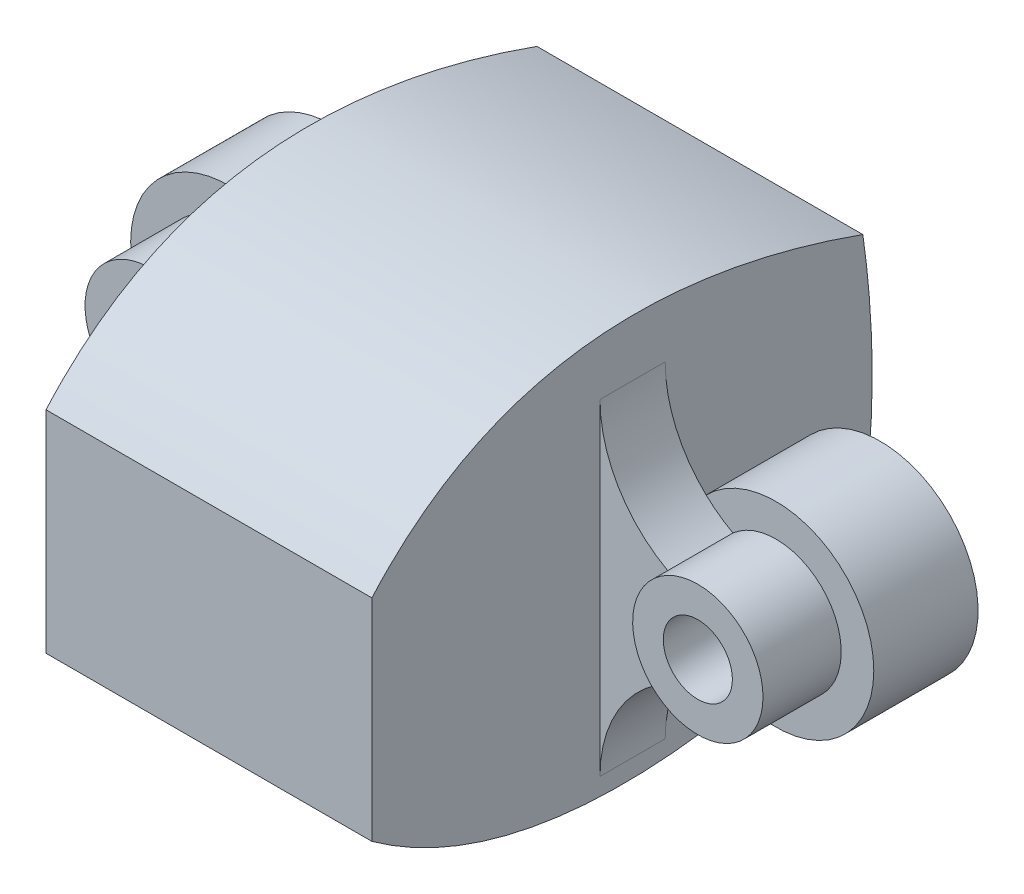
ISO-10303-21;
HEADER;
FILE_DESCRIPTION(('STEP AP214'),'2;1');
FILE_NAME('part.step','',(''),(''),'','','');
FILE_SCHEMA(('AUTOMOTIVE_DESIGN { 1 0 10303 214 1 1 1 1 }'));
ENDSEC;
DATA;
#1=APPLICATION_CONTEXT('core data for automotive mechanical design processes');
#2=APPLICATION_PROTOCOL_DEFINITION('international standard','automotive_design',2000,#1);
#3=PRODUCT_CONTEXT('',#1,'mechanical');
#4=PRODUCT('Part','Part','',(#3));
#5=PRODUCT_RELATED_PRODUCT_CATEGORY('part','',(#4));
#6=PRODUCT_DEFINITION_FORMATION('','',#4);
#7=PRODUCT_DEFINITION_CONTEXT('part definition',#1,'design');
#8=PRODUCT_DEFINITION('design','',#6,#7);
#9=PRODUCT_DEFINITION_SHAPE('','',#8);
#10=(LENGTH_UNIT() NAMED_UNIT(*) SI_UNIT(.MILLI.,.METRE.));
#11=(NAMED_UNIT(*) PLANE_ANGLE_UNIT() SI_UNIT($,.RADIAN.));
#12=(NAMED_UNIT(*) SI_UNIT($,.STERADIAN.) SOLID_ANGLE_UNIT());
#13=UNCERTAINTY_MEASURE_WITH_UNIT(LENGTH_MEASURE(1.E-05),#10,'distance_accuracy_value','');
#14=(GEOMETRIC_REPRESENTATION_CONTEXT(3) GLOBAL_UNCERTAINTY_ASSIGNED_CONTEXT((#13)) GLOBAL_UNIT_ASSIGNED_CONTEXT((#10,
#11,#12)) REPRESENTATION_CONTEXT('',''));
#15=CARTESIAN_POINT('',(0.,0.,0.));
#16=DIRECTION('',(0.,0.,1.));
#17=DIRECTION('',(1.,0.,0.));
#18=AXIS2_PLACEMENT_3D('',#15,#16,#17);
#19=CARTESIAN_POINT('',(27.5,-3.75484590396802,0.696184676668378));
#20=DIRECTION('',(0.,0.,-1.));
#21=DIRECTION('',(-1.,0.,0.));
#22=AXIS2_PLACEMENT_3D('',#19,#20,#21);
#23=PLANE('',#22);
#24=CARTESIAN_POINT('',(-21.0048094716167,-0.00484590396801488,0.696184676668378));
#25=DIRECTION('',(0.,0.,-1.));
#26=DIRECTION('',(-1.,0.,0.));
#27=AXIS2_PLACEMENT_3D('',#24,#25,#26);
#28=CIRCLE('',#27,5.);
#29=CARTESIAN_POINT('',(-17.697620332786,-3.75484590396802,0.696184676668378));
#30=VERTEX_POINT('',#29);
#31=CARTESIAN_POINT('',(-17.697620332786,3.74515409603199,0.696184676668378));
#32=VERTEX_POINT('',#31);
#33=EDGE_CURVE('E164',#30,#32,#28,.F.);
#34=ORIENTED_EDGE('',*,*,#33,.F.);
#35=CARTESIAN_POINT('',(-22.5,-12.5262283224885,0.696184676668378));
#36=DIRECTION('',(0.,0.,-1.));
#37=DIRECTION('',(-1.,0.,0.));
#38=AXIS2_PLACEMENT_3D('',#35,#36,#37);
#39=CIRCLE('',#38,10.);
#40=CARTESIAN_POINT('',(-12.5,-12.5262283224885,0.696184676668378));
#41=VERTEX_POINT('',#40);
#42=EDGE_CURVE('E44',#30,#41,#39,.T.);
#43=ORIENTED_EDGE('',*,*,#42,.T.);
#44=DIRECTION('',(0.,1.,0.));
#45=VECTOR('',#44,1.);
#46=CARTESIAN_POINT('',(-12.5,-13.9143828199088,0.696184676668378));
#47=LINE('',#46,#45);
#48=CARTESIAN_POINT('',(-12.5,12.5165365145524,0.696184676668378));
#49=VERTEX_POINT('',#48);
#50=EDGE_CURVE('E312',#41,#49,#47,.T.);
#51=ORIENTED_EDGE('',*,*,#50,.T.);
#52=CARTESIAN_POINT('',(-22.5,12.5165365145524,0.696184676668378));
#53=DIRECTION('',(0.,0.,-1.));
#54=DIRECTION('',(-1.,0.,0.));
#55=AXIS2_PLACEMENT_3D('',#52,#53,#54);
#56=CIRCLE('',#55,10.);
#57=EDGE_CURVE('E348',#49,#32,#56,.T.);
#58=ORIENTED_EDGE('',*,*,#57,.T.);
#59=EDGE_LOOP('',(#34,#43,#51,#58));
#60=FACE_BOUND('',#59,.T.);
#61=ADVANCED_FACE('F36',(#60),#23,.F.);
#62=CARTESIAN_POINT('',(21.0048094716167,-0.00484590396801488,0.696184676668378));
#63=DIRECTION('',(0.,0.,-1.));
#64=DIRECTION('',(-1.,0.,0.));
#65=AXIS2_PLACEMENT_3D('',#62,#63,#64);
#66=CIRCLE('',#65,5.);
#67=CARTESIAN_POINT('',(17.697620332786,3.74515409603199,0.696184676668378));
#68=VERTEX_POINT('',#67);
#69=CARTESIAN_POINT('',(17.697620332786,-3.75484590396802,0.696184676668378));
#70=VERTEX_POINT('',#69);
#71=EDGE_CURVE('E177',#68,#70,#66,.F.);
#72=ORIENTED_EDGE('',*,*,#71,.F.);
#73=CARTESIAN_POINT('',(22.5,12.5165365145524,0.696184676668378));
#74=DIRECTION('',(0.,0.,-1.));
#75=DIRECTION('',(-1.,0.,0.));
#76=AXIS2_PLACEMENT_3D('',#73,#74,#75);
#77=CIRCLE('',#76,10.);
#78=CARTESIAN_POINT('',(12.5,12.5165365145524,0.696184676668378));
#79=VERTEX_POINT('',#78);
#80=EDGE_CURVE('E342',#68,#79,#77,.T.);
#81=ORIENTED_EDGE('',*,*,#80,.T.);
#82=DIRECTION('',(0.,1.,0.));
#83=VECTOR('',#82,1.);
#84=CARTESIAN_POINT('',(12.5,-13.9143828199088,0.696184676668378));
#85=LINE('',#84,#83);
#86=CARTESIAN_POINT('',(12.5,-12.5262283224885,0.696184676668378));
#87=VERTEX_POINT('',#86);
#88=EDGE_CURVE('E190',#87,#79,#85,.T.);
#89=ORIENTED_EDGE('',*,*,#88,.F.);
#90=CARTESIAN_POINT('',(22.5,-12.5262283224885,0.696184676668378));
#91=DIRECTION('',(0.,0.,-1.));
#92=DIRECTION('',(-1.,0.,0.));
#93=AXIS2_PLACEMENT_3D('',#90,#91,#92);
#94=CIRCLE('',#93,10.);
#95=EDGE_CURVE('E334',#87,#70,#94,.T.);
#96=ORIENTED_EDGE('',*,*,#95,.T.);
#97=EDGE_LOOP('',(#72,#81,#89,#96));
#98=FACE_BOUND('',#97,.T.);
#99=ADVANCED_FACE('F238',(#98),#23,.F.);
#100=CARTESIAN_POINT('',(12.5,-13.9143828199088,-0.592625515878692));
#101=DIRECTION('',(1.,0.,0.));
#102=DIRECTION('',(0.,0.,-1.));
#103=AXIS2_PLACEMENT_3D('',#100,#101,#102);
#104=PLANE('',#103);
#105=CARTESIAN_POINT('',(12.5,-8.09421069616466,18.1961846766684));
#106=CARTESIAN_POINT('',(12.5,-16.4385603035779,6.64246983563475));
#107=CARTESIAN_POINT('',(12.5,-14.3857687324639,-8.25521453405886));
#108=CARTESIAN_POINT('',(12.5,-10.7478647549805,-18.0989547084256));
#109=B_SPLINE_CURVE_WITH_KNOTS('',3,(#105,#106,#107,#108),.UNSPECIFIED.,.F.,.F.,(4,4),(0.,1.),.UNSPECIFIED.);
#110=CARTESIAN_POINT('',(12.5,-8.09421069616467,18.1961846766684));
#111=VERTEX_POINT('',#110);
#112=CARTESIAN_POINT('',(12.5,-10.7478647549805,-18.0989547084256));
#113=VERTEX_POINT('',#112);
#114=EDGE_CURVE('E197',#111,#113,#109,.T.);
#115=ORIENTED_EDGE('',*,*,#114,.T.);
#116=CARTESIAN_POINT('',(12.5,-10.7478647549805,-18.0989547084256));
#117=CARTESIAN_POINT('',(12.5,-0.263434206745711,-21.4154582491938));
#118=CARTESIAN_POINT('',(12.5,13.3918270058603,-19.4685826097499));
#119=B_SPLINE_CURVE_WITH_KNOTS('',2,(#116,#117,#118),.UNSPECIFIED.,.F.,.F.,(3,3),(0.,1.),.UNSPECIFIED.);
#120=CARTESIAN_POINT('',(12.5,13.3918270058603,-19.4685826097499));
#121=VERTEX_POINT('',#120);
#122=EDGE_CURVE('E203',#113,#121,#119,.T.);
#123=ORIENTED_EDGE('',*,*,#122,.T.);
#124=CARTESIAN_POINT('',(12.5,13.3918270058603,-19.4685826097499));
#125=CARTESIAN_POINT('',(12.5,22.3791261316538,5.56746495496059));
#126=CARTESIAN_POINT('',(12.5,8.08451888822864,18.1961846766684));
#127=B_SPLINE_CURVE_WITH_KNOTS('',2,(#124,#125,#126),.UNSPECIFIED.,.F.,.F.,(3,3),(0.,1.),.UNSPECIFIED.);
#128=CARTESIAN_POINT('',(12.5,8.08451888822864,18.1961846766684));
#129=VERTEX_POINT('',#128);
#130=EDGE_CURVE('E268',#121,#129,#127,.T.);
#131=ORIENTED_EDGE('',*,*,#130,.T.);
#132=DIRECTION('',(0.,-1.,0.));
#133=VECTOR('',#132,1.);
#134=CARTESIAN_POINT('',(12.5,-8.09421069616467,18.1961846766684));
#135=LINE('',#134,#133);
#136=EDGE_CURVE('E273',#129,#111,#135,.T.);
#137=ORIENTED_EDGE('',*,*,#136,.T.);
#138=EDGE_LOOP('',(#115,#123,#131,#137));
#139=FACE_BOUND('',#138,.T.);
#140=DIRECTION('',(0.,0.,1.));
#141=VECTOR('',#140,1.);
#142=CARTESIAN_POINT('',(12.5,-12.5262283224885,0.696184676668378));
#143=LINE('',#142,#141);
#144=CARTESIAN_POINT('',(12.5,-12.5262283224885,-4.30381532333162));
#145=VERTEX_POINT('',#144);
#146=EDGE_CURVE('E320',#145,#87,#143,.T.);
#147=ORIENTED_EDGE('',*,*,#146,.T.);
#148=ORIENTED_EDGE('',*,*,#88,.T.);
#149=DIRECTION('',(0.,0.,1.));
#150=VECTOR('',#149,1.);
#151=CARTESIAN_POINT('',(12.5,12.5165365145524,-4.30381532333162));
#152=LINE('',#151,#150);
#153=CARTESIAN_POINT('',(12.5,12.5165365145524,-4.30381532333162));
#154=VERTEX_POINT('',#153);
#155=EDGE_CURVE('E317',#79,#154,#152,.F.);
#156=ORIENTED_EDGE('',*,*,#155,.T.);
#157=DIRECTION('',(0.,-1.,0.));
#158=VECTOR('',#157,1.);
#159=CARTESIAN_POINT('',(12.5,-13.9143828199088,-4.30381532333162));
#160=LINE('',#159,#158);
#161=EDGE_CURVE('E194',#154,#145,#160,.T.);
#162=ORIENTED_EDGE('',*,*,#161,.T.);
#163=EDGE_LOOP('',(#147,#148,#156,#162));
#164=FACE_BOUND('',#163,.T.);
#165=ADVANCED_FACE('F244',(#139,#164),#104,.T.);
#166=CARTESIAN_POINT('',(-12.5,-13.9143828199088,-0.592625515878692));
#167=DIRECTION('',(1.,0.,0.));
#168=DIRECTION('',(0.,0.,-1.));
#169=AXIS2_PLACEMENT_3D('',#166,#167,#168);
#170=PLANE('',#169);
#171=CARTESIAN_POINT('',(-12.5,-8.09421069616466,18.1961846766684));
#172=CARTESIAN_POINT('',(-12.5,-16.4385603035779,6.64246983563475));
#173=CARTESIAN_POINT('',(-12.5,-14.3857687324639,-8.25521453405886));
#174=CARTESIAN_POINT('',(-12.5,-10.7478647549805,-18.0989547084256));
#175=B_SPLINE_CURVE_WITH_KNOTS('',3,(#171,#172,#173,#174),.UNSPECIFIED.,.F.,.F.,(4,4),(0.,1.),.UNSPECIFIED.);
#176=CARTESIAN_POINT('',(-12.5,-8.09421069616467,18.1961846766684));
#177=VERTEX_POINT('',#176);
#178=CARTESIAN_POINT('',(-12.5,-10.7478647549805,-18.0989547084256));
#179=VERTEX_POINT('',#178);
#180=EDGE_CURVE('E196',#177,#179,#175,.T.);
#181=ORIENTED_EDGE('',*,*,#180,.F.);
#182=DIRECTION('',(0.,-1.,0.));
#183=VECTOR('',#182,1.);
#184=CARTESIAN_POINT('',(-12.5,-8.09421069616467,18.1961846766684));
#185=LINE('',#184,#183);
#186=CARTESIAN_POINT('',(-12.5,8.08451888822864,18.1961846766684));
#187=VERTEX_POINT('',#186);
#188=EDGE_CURVE('E204',#187,#177,#185,.T.);
#189=ORIENTED_EDGE('',*,*,#188,.F.);
#190=CARTESIAN_POINT('',(-12.5,13.3918270058603,-19.4685826097499));
#191=CARTESIAN_POINT('',(-12.5,22.3791261316538,5.56746495496059));
#192=CARTESIAN_POINT('',(-12.5,8.08451888822864,18.1961846766684));
#193=B_SPLINE_CURVE_WITH_KNOTS('',2,(#190,#191,#192),.UNSPECIFIED.,.F.,.F.,(3,3),(0.,1.),.UNSPECIFIED.);
#194=CARTESIAN_POINT('',(-12.5,13.3918270058603,-19.4685826097499));
#195=VERTEX_POINT('',#194);
#196=EDGE_CURVE('E290',#195,#187,#193,.T.);
#197=ORIENTED_EDGE('',*,*,#196,.F.);
#198=CARTESIAN_POINT('',(-12.5,-10.7478647549805,-18.0989547084256));
#199=CARTESIAN_POINT('',(-12.5,-0.263434206745711,-21.4154582491938));
#200=CARTESIAN_POINT('',(-12.5,13.3918270058603,-19.4685826097499));
#201=B_SPLINE_CURVE_WITH_KNOTS('',2,(#198,#199,#200),.UNSPECIFIED.,.F.,.F.,(3,3),(0.,1.),.UNSPECIFIED.);
#202=EDGE_CURVE('E283',#179,#195,#201,.T.);
#203=ORIENTED_EDGE('',*,*,#202,.F.);
#204=EDGE_LOOP('',(#181,#189,#197,#203));
#205=FACE_BOUND('',#204,.T.);
#206=DIRECTION('',(0.,-1.,0.));
#207=VECTOR('',#206,1.);
#208=CARTESIAN_POINT('',(-12.5,-13.9143828199088,-4.30381532333162));
#209=LINE('',#208,#207);
#210=CARTESIAN_POINT('',(-12.5,12.5165365145524,-4.30381532333162));
#211=VERTEX_POINT('',#210);
#212=CARTESIAN_POINT('',(-12.5,-12.5262283224885,-4.30381532333162));
#213=VERTEX_POINT('',#212);
#214=EDGE_CURVE('E314',#211,#213,#209,.T.);
#215=ORIENTED_EDGE('',*,*,#214,.F.);
#216=DIRECTION('',(0.,0.,-1.));
#217=VECTOR('',#216,1.);
#218=CARTESIAN_POINT('',(-12.5,12.5165365145524,-0.592625515878692));
#219=LINE('',#218,#217);
#220=EDGE_CURVE('E148',#211,#49,#219,.F.);
#221=ORIENTED_EDGE('',*,*,#220,.T.);
#222=ORIENTED_EDGE('',*,*,#50,.F.);
#223=DIRECTION('',(0.,0.,-1.));
#224=VECTOR('',#223,1.);
#225=CARTESIAN_POINT('',(-12.5,-12.5262283224885,-0.592625515878692));
#226=LINE('',#225,#224);
#227=EDGE_CURVE('E328',#41,#213,#226,.T.);
#228=ORIENTED_EDGE('',*,*,#227,.T.);
#229=EDGE_LOOP('',(#215,#221,#222,#228));
#230=FACE_BOUND('',#229,.T.);
#231=ADVANCED_FACE('F218',(#205,#230),#170,.F.);
#232=DIRECTION('',(-1.,0.,0.));
#233=VECTOR('',#232,1.);
#234=SURFACE_OF_LINEAR_EXTRUSION('',#109,#233);
#235=ORIENTED_EDGE('',*,*,#180,.T.);
#236=DIRECTION('',(-1.,0.,0.));
#237=VECTOR('',#236,1.);
#238=CARTESIAN_POINT('',(12.5,-10.7478647549805,-18.0989547084256));
#239=LINE('',#238,#237);
#240=EDGE_CURVE('E309',#113,#179,#239,.T.);
#241=ORIENTED_EDGE('',*,*,#240,.F.);
#242=ORIENTED_EDGE('',*,*,#114,.F.);
#243=DIRECTION('',(-1.,0.,0.));
#244=VECTOR('',#243,1.);
#245=CARTESIAN_POINT('',(12.5,-8.09421069616467,18.1961846766684));
#246=LINE('',#245,#244);
#247=EDGE_CURVE('E278',#111,#177,#246,.T.);
#248=ORIENTED_EDGE('',*,*,#247,.T.);
#249=EDGE_LOOP('',(#235,#241,#242,#248));
#250=FACE_BOUND('',#249,.T.);
#251=ADVANCED_FACE('F213',(#250),#234,.F.);
#252=DIRECTION('',(-1.,0.,0.));
#253=VECTOR('',#252,1.);
#254=SURFACE_OF_LINEAR_EXTRUSION('',#119,#253);
#255=ORIENTED_EDGE('',*,*,#202,.T.);
#256=DIRECTION('',(-1.,0.,0.));
#257=VECTOR('',#256,1.);
#258=CARTESIAN_POINT('',(12.5,13.3918270058603,-19.4685826097499));
#259=LINE('',#258,#257);
#260=EDGE_CURVE('E306',#121,#195,#259,.T.);
#261=ORIENTED_EDGE('',*,*,#260,.F.);
#262=ORIENTED_EDGE('',*,*,#122,.F.);
#263=ORIENTED_EDGE('',*,*,#240,.T.);
#264=EDGE_LOOP('',(#255,#261,#262,#263));
#265=FACE_BOUND('',#264,.T.);
#266=ADVANCED_FACE('F217',(#265),#254,.F.);
#267=DIRECTION('',(-1.,0.,0.));
#268=VECTOR('',#267,1.);
#269=SURFACE_OF_LINEAR_EXTRUSION('',#127,#268);
#270=ORIENTED_EDGE('',*,*,#196,.T.);
#271=DIRECTION('',(-1.,0.,0.));
#272=VECTOR('',#271,1.);
#273=CARTESIAN_POINT('',(12.5,8.08451888822864,18.1961846766684));
#274=LINE('',#273,#272);
#275=EDGE_CURVE('E303',#129,#187,#274,.T.);
#276=ORIENTED_EDGE('',*,*,#275,.F.);
#277=ORIENTED_EDGE('',*,*,#130,.F.);
#278=ORIENTED_EDGE('',*,*,#260,.T.);
#279=EDGE_LOOP('',(#270,#276,#277,#278));
#280=FACE_BOUND('',#279,.T.);
#281=ADVANCED_FACE('F264',(#280),#269,.F.);
#282=CARTESIAN_POINT('',(12.5,-8.09421069616467,18.1961846766684));
#283=DIRECTION('',(0.,0.,-1.));
#284=DIRECTION('',(-1.,0.,0.));
#285=AXIS2_PLACEMENT_3D('',#282,#283,#284);
#286=PLANE('',#285);
#287=ORIENTED_EDGE('',*,*,#188,.T.);
#288=ORIENTED_EDGE('',*,*,#247,.F.);
#289=ORIENTED_EDGE('',*,*,#136,.F.);
#290=ORIENTED_EDGE('',*,*,#275,.T.);
#291=EDGE_LOOP('',(#287,#288,#289,#290));
#292=FACE_BOUND('',#291,.T.);
#293=ADVANCED_FACE('F262',(#292),#286,.F.);
#294=CARTESIAN_POINT('',(27.5,-3.75484590396802,-4.30381532333162));
#295=DIRECTION('',(0.,0.,1.));
#296=DIRECTION('',(1.,0.,0.));
#297=AXIS2_PLACEMENT_3D('',#294,#295,#296);
#298=PLANE('',#297);
#299=CARTESIAN_POINT('',(-21.0048094716167,-0.00484590396801488,-4.30381532333162));
#300=DIRECTION('',(0.,0.,1.));
#301=DIRECTION('',(1.,0.,0.));
#302=AXIS2_PLACEMENT_3D('',#299,#300,#301);
#303=CIRCLE('',#302,7.5);
#304=CARTESIAN_POINT('',(-15.6421857546785,5.2384609600761,-4.30381532333162));
#305=VERTEX_POINT('',#304);
#306=CARTESIAN_POINT('',(-15.6421857546785,-5.24815276801212,-4.30381532333162));
#307=VERTEX_POINT('',#306);
#308=EDGE_CURVE('E50',#305,#307,#303,.F.);
#309=ORIENTED_EDGE('',*,*,#308,.F.);
#310=CARTESIAN_POINT('',(-22.5,12.5165365145524,-4.30381532333162));
#311=DIRECTION('',(0.,0.,1.));
#312=DIRECTION('',(1.,0.,0.));
#313=AXIS2_PLACEMENT_3D('',#310,#311,#312);
#314=CIRCLE('',#313,10.);
#315=EDGE_CURVE('E345',#305,#211,#314,.T.);
#316=ORIENTED_EDGE('',*,*,#315,.T.);
#317=ORIENTED_EDGE('',*,*,#214,.T.);
#318=CARTESIAN_POINT('',(-22.5,-12.5262283224885,-4.30381532333162));
#319=DIRECTION('',(0.,0.,1.));
#320=DIRECTION('',(1.,0.,0.));
#321=AXIS2_PLACEMENT_3D('',#318,#319,#320);
#322=CIRCLE('',#321,10.);
#323=EDGE_CURVE('E11',#213,#307,#322,.T.);
#324=ORIENTED_EDGE('',*,*,#323,.T.);
#325=EDGE_LOOP('',(#309,#316,#317,#324));
#326=FACE_BOUND('',#325,.T.);
#327=ADVANCED_FACE('F254',(#326),#298,.F.);
#328=CARTESIAN_POINT('',(21.0048094716167,-0.00484590396801488,-4.30381532333162));
#329=DIRECTION('',(0.,0.,-1.));
#330=DIRECTION('',(-1.,0.,0.));
#331=AXIS2_PLACEMENT_3D('',#328,#329,#330);
#332=CIRCLE('',#331,7.5);
#333=CARTESIAN_POINT('',(15.6421857546785,-5.24815276801213,-4.30381532333162));
#334=VERTEX_POINT('',#333);
#335=CARTESIAN_POINT('',(15.6421857546785,5.2384609600761,-4.30381532333162));
#336=VERTEX_POINT('',#335);
#337=EDGE_CURVE('E58',#334,#336,#332,.T.);
#338=ORIENTED_EDGE('',*,*,#337,.F.);
#339=CARTESIAN_POINT('',(22.5,-12.5262283224885,-4.30381532333162));
#340=DIRECTION('',(0.,0.,1.));
#341=DIRECTION('',(1.,0.,0.));
#342=AXIS2_PLACEMENT_3D('',#339,#340,#341);
#343=CIRCLE('',#342,10.);
#344=EDGE_CURVE('E336',#334,#145,#343,.T.);
#345=ORIENTED_EDGE('',*,*,#344,.T.);
#346=ORIENTED_EDGE('',*,*,#161,.F.);
#347=CARTESIAN_POINT('',(22.5,12.5165365145524,-4.30381532333162));
#348=DIRECTION('',(0.,0.,1.));
#349=DIRECTION('',(1.,0.,0.));
#350=AXIS2_PLACEMENT_3D('',#347,#348,#349);
#351=CIRCLE('',#350,10.);
#352=EDGE_CURVE('E339',#154,#336,#351,.T.);
#353=ORIENTED_EDGE('',*,*,#352,.T.);
#354=EDGE_LOOP('',(#338,#345,#346,#353));
#355=FACE_BOUND('',#354,.T.);
#356=ADVANCED_FACE('F250',(#355),#298,.F.);
#357=CARTESIAN_POINT('',(21.0048094716167,-0.00484590396801488,-4.30381532333162));
#358=DIRECTION('',(0.,0.,-1.));
#359=DIRECTION('',(-1.,0.,0.));
#360=AXIS2_PLACEMENT_3D('',#357,#358,#359);
#361=PLANE('',#360);
#362=CARTESIAN_POINT('',(21.0048094716167,-0.00484590396801488,-4.30381532333162));
#363=DIRECTION('',(0.,0.,1.));
#364=DIRECTION('',(1.,0.,0.));
#365=AXIS2_PLACEMENT_3D('',#362,#363,#364);
#366=CIRCLE('',#365,5.);
#367=CARTESIAN_POINT('',(17.697620332786,-3.75484590396802,-4.30381532333162));
#368=VERTEX_POINT('',#367);
#369=CARTESIAN_POINT('',(17.697620332786,3.74515409603199,-4.30381532333162));
#370=VERTEX_POINT('',#369);
#371=EDGE_CURVE('E163',#368,#370,#366,.T.);
#372=ORIENTED_EDGE('',*,*,#371,.F.);
#373=CARTESIAN_POINT('',(22.5,-12.5262283224885,-4.30381532333162));
#374=DIRECTION('',(0.,0.,-1.));
#375=DIRECTION('',(-1.,0.,0.));
#376=AXIS2_PLACEMENT_3D('',#373,#374,#375);
#377=CIRCLE('',#376,10.);
#378=EDGE_CURVE('E325',#368,#334,#377,.F.);
#379=ORIENTED_EDGE('',*,*,#378,.T.);
#380=EDGE_CURVE('E191',#336,#334,#332,.T.);
#381=ORIENTED_EDGE('',*,*,#380,.F.);
#382=CARTESIAN_POINT('',(22.5,12.5165365145524,-4.30381532333162));
#383=DIRECTION('',(0.,0.,-1.));
#384=DIRECTION('',(-1.,0.,0.));
#385=AXIS2_PLACEMENT_3D('',#382,#383,#384);
#386=CIRCLE('',#385,10.);
#387=EDGE_CURVE('E323',#336,#370,#386,.F.);
#388=ORIENTED_EDGE('',*,*,#387,.T.);
#389=EDGE_LOOP('',(#372,#379,#381,#388));
#390=FACE_BOUND('',#389,.T.);
#391=ADVANCED_FACE('F253',(#390),#361,.F.);
#392=CARTESIAN_POINT('',(21.0048094716167,-0.00484590396801488,-12.3038153233316));
#393=DIRECTION('',(0.,0.,1.));
#394=DIRECTION('',(1.,0.,0.));
#395=AXIS2_PLACEMENT_3D('',#392,#393,#394);
#396=CYLINDRICAL_SURFACE('',#395,7.5);
#397=CARTESIAN_POINT('',(21.0048094716167,-0.00484590396801488,-12.3038153233316));
#398=DIRECTION('',(0.,0.,-1.));
#399=DIRECTION('',(-1.,0.,0.));
#400=AXIS2_PLACEMENT_3D('',#397,#398,#399);
#401=CIRCLE('',#400,7.5);
#402=CARTESIAN_POINT('',(13.5048094716167,-0.00484590396801488,-12.3038153233316));
#403=VERTEX_POINT('',#402);
#404=EDGE_CURVE('E187',#403,#403,#401,.T.);
#405=ORIENTED_EDGE('',*,*,#404,.F.);
#406=EDGE_LOOP('',(#405));
#407=FACE_BOUND('',#406,.T.);
#408=ORIENTED_EDGE('',*,*,#337,.T.);
#409=ORIENTED_EDGE('',*,*,#380,.T.);
#410=EDGE_LOOP('',(#408,#409));
#411=FACE_BOUND('',#410,.T.);
#412=ADVANCED_FACE('F248',(#407,#411),#396,.T.);
#413=CARTESIAN_POINT('',(21.0048094716167,-0.00484590396801488,-12.3038153233316));
#414=DIRECTION('',(0.,0.,-1.));
#415=DIRECTION('',(-1.,0.,0.));
#416=AXIS2_PLACEMENT_3D('',#413,#414,#415);
#417=PLANE('',#416);
#418=ORIENTED_EDGE('',*,*,#404,.T.);
#419=EDGE_LOOP('',(#418));
#420=FACE_BOUND('',#419,.T.);
#421=ADVANCED_FACE('F399',(#420),#417,.T.);
#422=CARTESIAN_POINT('',(-21.0048094716167,-0.00484590396801488,-4.30381532333162));
#423=DIRECTION('',(0.,0.,-1.));
#424=DIRECTION('',(-1.,0.,0.));
#425=AXIS2_PLACEMENT_3D('',#422,#423,#424);
#426=PLANE('',#425);
#427=CARTESIAN_POINT('',(-21.0048094716167,-0.00484590396801488,-4.30381532333162));
#428=DIRECTION('',(0.,0.,1.));
#429=DIRECTION('',(1.,0.,0.));
#430=AXIS2_PLACEMENT_3D('',#427,#428,#429);
#431=CIRCLE('',#430,5.);
#432=CARTESIAN_POINT('',(-17.697620332786,3.74515409603199,-4.30381532333162));
#433=VERTEX_POINT('',#432);
#434=CARTESIAN_POINT('',(-17.697620332786,-3.75484590396802,-4.30381532333162));
#435=VERTEX_POINT('',#434);
#436=EDGE_CURVE('E141',#433,#435,#431,.T.);
#437=ORIENTED_EDGE('',*,*,#436,.F.);
#438=CARTESIAN_POINT('',(-22.5,12.5165365145524,-4.30381532333162));
#439=DIRECTION('',(0.,0.,-1.));
#440=DIRECTION('',(-1.,0.,0.));
#441=AXIS2_PLACEMENT_3D('',#438,#439,#440);
#442=CIRCLE('',#441,10.);
#443=EDGE_CURVE('E147',#433,#305,#442,.F.);
#444=ORIENTED_EDGE('',*,*,#443,.T.);
#445=CARTESIAN_POINT('',(-21.0048094716167,-0.00484590396801488,-4.30381532333162));
#446=DIRECTION('',(0.,0.,-1.));
#447=DIRECTION('',(-1.,0.,0.));
#448=AXIS2_PLACEMENT_3D('',#445,#446,#447);
#449=CIRCLE('',#448,7.5);
#450=EDGE_CURVE('E143',#307,#305,#449,.T.);
#451=ORIENTED_EDGE('',*,*,#450,.F.);
#452=CARTESIAN_POINT('',(-22.5,-12.5262283224885,-4.30381532333162));
#453=DIRECTION('',(0.,0.,-1.));
#454=DIRECTION('',(-1.,0.,0.));
#455=AXIS2_PLACEMENT_3D('',#452,#453,#454);
#456=CIRCLE('',#455,10.);
#457=EDGE_CURVE('E137',#307,#435,#456,.F.);
#458=ORIENTED_EDGE('',*,*,#457,.T.);
#459=EDGE_LOOP('',(#437,#444,#451,#458));
#460=FACE_BOUND('',#459,.T.);
#461=ADVANCED_FACE('F139',(#460),#426,.F.);
#462=CARTESIAN_POINT('',(-21.0048094716167,-0.00484590396801488,-12.3038153233316));
#463=DIRECTION('',(0.,0.,1.));
#464=DIRECTION('',(1.,0.,0.));
#465=AXIS2_PLACEMENT_3D('',#462,#463,#464);
#466=CYLINDRICAL_SURFACE('',#465,7.5);
#467=CARTESIAN_POINT('',(-21.0048094716167,-0.00484590396801488,-12.3038153233316));
#468=DIRECTION('',(0.,0.,-1.));
#469=DIRECTION('',(-1.,0.,0.));
#470=AXIS2_PLACEMENT_3D('',#467,#468,#469);
#471=CIRCLE('',#470,7.5);
#472=CARTESIAN_POINT('',(-28.5048094716167,-0.00484590396801488,-12.3038153233316));
#473=VERTEX_POINT('',#472);
#474=EDGE_CURVE('E183',#473,#473,#471,.T.);
#475=ORIENTED_EDGE('',*,*,#474,.F.);
#476=EDGE_LOOP('',(#475));
#477=FACE_BOUND('',#476,.T.);
#478=ORIENTED_EDGE('',*,*,#308,.T.);
#479=ORIENTED_EDGE('',*,*,#450,.T.);
#480=EDGE_LOOP('',(#478,#479));
#481=FACE_BOUND('',#480,.T.);
#482=ADVANCED_FACE('F411',(#477,#481),#466,.T.);
#483=CARTESIAN_POINT('',(-21.0048094716167,-0.00484590396801488,-12.3038153233316));
#484=DIRECTION('',(0.,0.,-1.));
#485=DIRECTION('',(-1.,0.,0.));
#486=AXIS2_PLACEMENT_3D('',#483,#484,#485);
#487=PLANE('',#486);
#488=ORIENTED_EDGE('',*,*,#474,.T.);
#489=EDGE_LOOP('',(#488));
#490=FACE_BOUND('',#489,.T.);
#491=ADVANCED_FACE('F385',(#490),#487,.T.);
#492=CARTESIAN_POINT('',(21.0048094716167,-0.00484590396801488,1.69618467666838));
#493=DIRECTION('',(0.,0.,-1.));
#494=DIRECTION('',(-1.,0.,0.));
#495=AXIS2_PLACEMENT_3D('',#492,#493,#494);
#496=CYLINDRICAL_SURFACE('',#495,5.);
#497=CARTESIAN_POINT('',(21.0048094716167,-0.00484590396801488,1.69618467666838));
#498=DIRECTION('',(0.,0.,1.));
#499=DIRECTION('',(1.,0.,0.));
#500=AXIS2_PLACEMENT_3D('',#497,#498,#499);
#501=CIRCLE('',#500,5.);
#502=CARTESIAN_POINT('',(26.0048094716167,-0.00484590396801488,1.69618467666838));
#503=VERTEX_POINT('',#502);
#504=EDGE_CURVE('E167',#503,#503,#501,.T.);
#505=ORIENTED_EDGE('',*,*,#504,.F.);
#506=EDGE_LOOP('',(#505));
#507=FACE_BOUND('',#506,.T.);
#508=ORIENTED_EDGE('',*,*,#371,.T.);
#509=DIRECTION('',(0.,0.,-1.));
#510=VECTOR('',#509,1.);
#511=CARTESIAN_POINT('',(17.697620332786,3.74515409603199,1.69618467666838));
#512=LINE('',#511,#510);
#513=EDGE_CURVE('E180',#370,#68,#512,.F.);
#514=ORIENTED_EDGE('',*,*,#513,.T.);
#515=ORIENTED_EDGE('',*,*,#71,.T.);
#516=DIRECTION('',(0.,0.,-1.));
#517=VECTOR('',#516,1.);
#518=CARTESIAN_POINT('',(17.697620332786,-3.75484590396802,1.69618467666838));
#519=LINE('',#518,#517);
#520=EDGE_CURVE('E173',#70,#368,#519,.T.);
#521=ORIENTED_EDGE('',*,*,#520,.T.);
#522=EDGE_LOOP('',(#508,#514,#515,#521));
#523=FACE_BOUND('',#522,.T.);
#524=ADVANCED_FACE('F379',(#507,#523),#496,.T.);
#525=CARTESIAN_POINT('',(21.0048094716167,-0.00484590396801488,1.69618467666838));
#526=DIRECTION('',(0.,0.,1.));
#527=DIRECTION('',(1.,0.,0.));
#528=AXIS2_PLACEMENT_3D('',#525,#526,#527);
#529=PLANE('',#528);
#530=CARTESIAN_POINT('',(21.0048094716167,-0.00484590396801488,1.69618467666838));
#531=DIRECTION('',(0.,0.,1.));
#532=DIRECTION('',(1.,0.,0.));
#533=AXIS2_PLACEMENT_3D('',#530,#531,#532);
#534=CIRCLE('',#533,2.65);
#535=CARTESIAN_POINT('',(23.6548094716167,-0.00484590396801488,1.69618467666838));
#536=VERTEX_POINT('',#535);
#537=EDGE_CURVE('E361',#536,#536,#534,.T.);
#538=ORIENTED_EDGE('',*,*,#537,.F.);
#539=EDGE_LOOP('',(#538));
#540=FACE_BOUND('',#539,.T.);
#541=ORIENTED_EDGE('',*,*,#504,.T.);
#542=EDGE_LOOP('',(#541));
#543=FACE_BOUND('',#542,.T.);
#544=ADVANCED_FACE('F376',(#540,#543),#529,.T.);
#545=CARTESIAN_POINT('',(-21.0048094716167,-0.00484590396801488,1.69618467666838));
#546=DIRECTION('',(0.,0.,-1.));
#547=DIRECTION('',(-1.,0.,0.));
#548=AXIS2_PLACEMENT_3D('',#545,#546,#547);
#549=CYLINDRICAL_SURFACE('',#548,5.);
#550=CARTESIAN_POINT('',(-21.0048094716167,-0.00484590396801488,1.69618467666838));
#551=DIRECTION('',(0.,0.,1.));
#552=DIRECTION('',(1.,0.,0.));
#553=AXIS2_PLACEMENT_3D('',#550,#551,#552);
#554=CIRCLE('',#553,5.);
#555=CARTESIAN_POINT('',(-16.0048094716167,-0.00484590396801488,1.69618467666838));
#556=VERTEX_POINT('',#555);
#557=EDGE_CURVE('E157',#556,#556,#554,.T.);
#558=ORIENTED_EDGE('',*,*,#557,.F.);
#559=EDGE_LOOP('',(#558));
#560=FACE_BOUND('',#559,.T.);
#561=ORIENTED_EDGE('',*,*,#436,.T.);
#562=DIRECTION('',(0.,0.,-1.));
#563=VECTOR('',#562,1.);
#564=CARTESIAN_POINT('',(-17.697620332786,-3.75484590396802,1.69618467666838));
#565=LINE('',#564,#563);
#566=EDGE_CURVE('E154',#435,#30,#565,.F.);
#567=ORIENTED_EDGE('',*,*,#566,.T.);
#568=ORIENTED_EDGE('',*,*,#33,.T.);
#569=DIRECTION('',(0.,0.,-1.));
#570=VECTOR('',#569,1.);
#571=CARTESIAN_POINT('',(-17.697620332786,3.74515409603199,1.69618467666838));
#572=LINE('',#571,#570);
#573=EDGE_CURVE('E156',#32,#433,#572,.T.);
#574=ORIENTED_EDGE('',*,*,#573,.T.);
#575=EDGE_LOOP('',(#561,#567,#568,#574));
#576=FACE_BOUND('',#575,.T.);
#577=ADVANCED_FACE('F152',(#560,#576),#549,.T.);
#578=CARTESIAN_POINT('',(-21.0048094716167,-0.00484590396801488,1.69618467666838));
#579=DIRECTION('',(0.,0.,1.));
#580=DIRECTION('',(1.,0.,0.));
#581=AXIS2_PLACEMENT_3D('',#578,#579,#580);
#582=PLANE('',#581);
#583=CARTESIAN_POINT('',(-21.0048094716167,-0.00484590396801488,1.69618467666838));
#584=DIRECTION('',(0.,0.,1.));
#585=DIRECTION('',(1.,0.,0.));
#586=AXIS2_PLACEMENT_3D('',#583,#584,#585);
#587=CIRCLE('',#586,2.65);
#588=CARTESIAN_POINT('',(-18.3548094716167,-0.00484590396801488,1.69618467666838));
#589=VERTEX_POINT('',#588);
#590=EDGE_CURVE('E355',#589,#589,#587,.T.);
#591=ORIENTED_EDGE('',*,*,#590,.F.);
#592=EDGE_LOOP('',(#591));
#593=FACE_BOUND('',#592,.T.);
#594=ORIENTED_EDGE('',*,*,#557,.T.);
#595=EDGE_LOOP('',(#594));
#596=FACE_BOUND('',#595,.T.);
#597=ADVANCED_FACE('F225',(#593,#596),#582,.T.);
#598=CARTESIAN_POINT('',(22.5,-12.5262283224885,1.69618467666838));
#599=DIRECTION('',(0.,0.,-1.));
#600=DIRECTION('',(-1.,0.,0.));
#601=AXIS2_PLACEMENT_3D('',#598,#599,#600);
#602=CYLINDRICAL_SURFACE('',#601,10.);
#603=ORIENTED_EDGE('',*,*,#378,.F.);
#604=ORIENTED_EDGE('',*,*,#520,.F.);
#605=ORIENTED_EDGE('',*,*,#95,.F.);
#606=ORIENTED_EDGE('',*,*,#146,.F.);
#607=ORIENTED_EDGE('',*,*,#344,.F.);
#608=EDGE_LOOP('',(#603,#604,#605,#606,#607));
#609=FACE_BOUND('',#608,.T.);
#610=ADVANCED_FACE('F221',(#609),#602,.F.);
#611=CARTESIAN_POINT('',(22.5,12.5165365145524,1.69618467666838));
#612=DIRECTION('',(0.,0.,-1.));
#613=DIRECTION('',(-1.,0.,0.));
#614=AXIS2_PLACEMENT_3D('',#611,#612,#613);
#615=CYLINDRICAL_SURFACE('',#614,10.);
#616=ORIENTED_EDGE('',*,*,#80,.F.);
#617=ORIENTED_EDGE('',*,*,#513,.F.);
#618=ORIENTED_EDGE('',*,*,#387,.F.);
#619=ORIENTED_EDGE('',*,*,#352,.F.);
#620=ORIENTED_EDGE('',*,*,#155,.F.);
#621=EDGE_LOOP('',(#616,#617,#618,#619,#620));
#622=FACE_BOUND('',#621,.T.);
#623=ADVANCED_FACE('F224',(#622),#615,.F.);
#624=CARTESIAN_POINT('',(-22.5,12.5165365145524,1.69618467666838));
#625=DIRECTION('',(0.,0.,-1.));
#626=DIRECTION('',(-1.,0.,0.));
#627=AXIS2_PLACEMENT_3D('',#624,#625,#626);
#628=CYLINDRICAL_SURFACE('',#627,10.);
#629=ORIENTED_EDGE('',*,*,#57,.F.);
#630=ORIENTED_EDGE('',*,*,#220,.F.);
#631=ORIENTED_EDGE('',*,*,#315,.F.);
#632=ORIENTED_EDGE('',*,*,#443,.F.);
#633=ORIENTED_EDGE('',*,*,#573,.F.);
#634=EDGE_LOOP('',(#629,#630,#631,#632,#633));
#635=FACE_BOUND('',#634,.T.);
#636=ADVANCED_FACE('F228',(#635),#628,.F.);
#637=CARTESIAN_POINT('',(-22.5,-12.5262283224885,1.69618467666838));
#638=DIRECTION('',(0.,0.,-1.));
#639=DIRECTION('',(-1.,0.,0.));
#640=AXIS2_PLACEMENT_3D('',#637,#638,#639);
#641=CYLINDRICAL_SURFACE('',#640,10.);
#642=ORIENTED_EDGE('',*,*,#323,.F.);
#643=ORIENTED_EDGE('',*,*,#227,.F.);
#644=ORIENTED_EDGE('',*,*,#42,.F.);
#645=ORIENTED_EDGE('',*,*,#566,.F.);
#646=ORIENTED_EDGE('',*,*,#457,.F.);
#647=EDGE_LOOP('',(#642,#643,#644,#645,#646));
#648=FACE_BOUND('',#647,.T.);
#649=ADVANCED_FACE('F38',(#648),#641,.F.);
#650=CARTESIAN_POINT('',(-21.0048094716167,-0.00484590396801488,-4.30381532333162));
#651=DIRECTION('',(0.,0.,1.));
#652=DIRECTION('',(1.,0.,0.));
#653=AXIS2_PLACEMENT_3D('',#650,#651,#652);
#654=CYLINDRICAL_SURFACE('',#653,2.65);
#655=CARTESIAN_POINT('',(-21.0048094716167,-0.00484590396801488,-4.30381532333162));
#656=DIRECTION('',(0.,0.,1.));
#657=DIRECTION('',(1.,0.,0.));
#658=AXIS2_PLACEMENT_3D('',#655,#656,#657);
#659=CIRCLE('',#658,2.65);
#660=CARTESIAN_POINT('',(-18.3548094716167,-0.00484590396801488,-4.30381532333162));
#661=VERTEX_POINT('',#660);
#662=EDGE_CURVE('E358',#661,#661,#659,.T.);
#663=ORIENTED_EDGE('',*,*,#662,.F.);
#664=EDGE_LOOP('',(#663));
#665=FACE_BOUND('',#664,.T.);
#666=ORIENTED_EDGE('',*,*,#590,.T.);
#667=EDGE_LOOP('',(#666));
#668=FACE_BOUND('',#667,.T.);
#669=ADVANCED_FACE('F235',(#665,#668),#654,.F.);
#670=CARTESIAN_POINT('',(-21.0048094716167,-0.00484590396801488,-4.30381532333162));
#671=DIRECTION('',(0.,0.,1.));
#672=DIRECTION('',(1.,0.,0.));
#673=AXIS2_PLACEMENT_3D('',#670,#671,#672);
#674=PLANE('',#673);
#675=ORIENTED_EDGE('',*,*,#662,.T.);
#676=EDGE_LOOP('',(#675));
#677=FACE_BOUND('',#676,.T.);
#678=ADVANCED_FACE('F372',(#677),#674,.T.);
#679=CARTESIAN_POINT('',(21.0048094716167,-0.00484590396801488,-4.30381532333162));
#680=DIRECTION('',(0.,0.,1.));
#681=DIRECTION('',(1.,0.,0.));
#682=AXIS2_PLACEMENT_3D('',#679,#680,#681);
#683=CYLINDRICAL_SURFACE('',#682,2.65);
#684=CARTESIAN_POINT('',(21.0048094716167,-0.00484590396801488,-4.30381532333162));
#685=DIRECTION('',(0.,0.,1.));
#686=DIRECTION('',(1.,0.,0.));
#687=AXIS2_PLACEMENT_3D('',#684,#685,#686);
#688=CIRCLE('',#687,2.65);
#689=CARTESIAN_POINT('',(23.6548094716167,-0.00484590396801488,-4.30381532333162));
#690=VERTEX_POINT('',#689);
#691=EDGE_CURVE('E158',#690,#690,#688,.T.);
#692=ORIENTED_EDGE('',*,*,#691,.F.);
#693=EDGE_LOOP('',(#692));
#694=FACE_BOUND('',#693,.T.);
#695=ORIENTED_EDGE('',*,*,#537,.T.);
#696=EDGE_LOOP('',(#695));
#697=FACE_BOUND('',#696,.T.);
#698=ADVANCED_FACE('F369',(#694,#697),#683,.F.);
#699=CARTESIAN_POINT('',(21.0048094716167,-0.00484590396801488,-4.30381532333162));
#700=DIRECTION('',(0.,0.,1.));
#701=DIRECTION('',(1.,0.,0.));
#702=AXIS2_PLACEMENT_3D('',#699,#700,#701);
#703=PLANE('',#702);
#704=ORIENTED_EDGE('',*,*,#691,.T.);
#705=EDGE_LOOP('',(#704));
#706=FACE_BOUND('',#705,.T.);
#707=ADVANCED_FACE('F367',(#706),#703,.T.);
#708=CLOSED_SHELL('',(#61,#99,#165,#231,#251,#266,#281,#293,#327,#356,#391,#412,#421,#461,#482,
#491,#524,#544,#577,#597,#610,#623,#636,#649,#669,#678,#698,#707));
#709=MANIFOLD_SOLID_BREP('B2',#708);
#710=ADVANCED_BREP_SHAPE_REPRESENTATION('',(#18,#709),#14);
#711=SHAPE_DEFINITION_REPRESENTATION(#9,#710);
ENDSEC;
END-ISO-10303-21;
